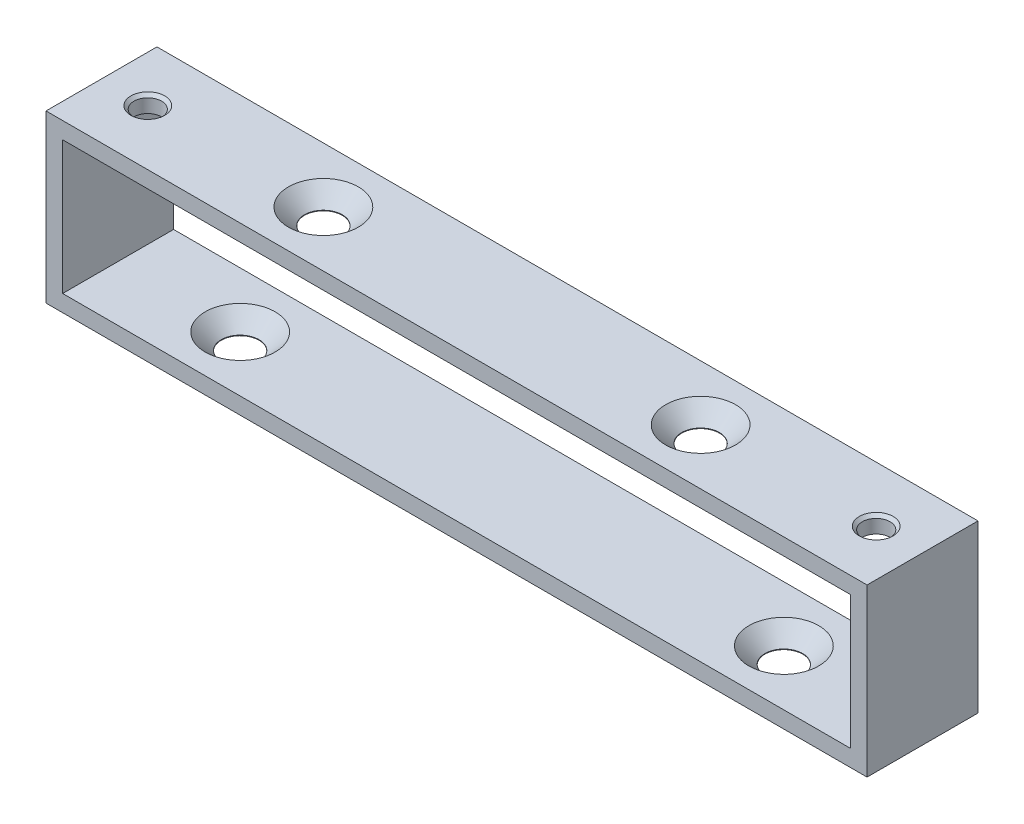
ISO-10303-21;
HEADER;
FILE_DESCRIPTION(('STEP AP214'),'2;1');
FILE_NAME('part.step','',(''),(''),'','','');
FILE_SCHEMA(('AUTOMOTIVE_DESIGN { 1 0 10303 214 1 1 1 1 }'));
ENDSEC;
DATA;
#1=APPLICATION_CONTEXT('core data for automotive mechanical design processes');
#2=APPLICATION_PROTOCOL_DEFINITION('international standard','automotive_design',2000,#1);
#3=PRODUCT_CONTEXT('',#1,'mechanical');
#4=PRODUCT('Part','Part','',(#3));
#5=PRODUCT_RELATED_PRODUCT_CATEGORY('part','',(#4));
#6=PRODUCT_DEFINITION_FORMATION('','',#4);
#7=PRODUCT_DEFINITION_CONTEXT('part definition',#1,'design');
#8=PRODUCT_DEFINITION('design','',#6,#7);
#9=PRODUCT_DEFINITION_SHAPE('','',#8);
#10=(LENGTH_UNIT() NAMED_UNIT(*) SI_UNIT(.MILLI.,.METRE.));
#11=(NAMED_UNIT(*) PLANE_ANGLE_UNIT() SI_UNIT($,.RADIAN.));
#12=(NAMED_UNIT(*) SI_UNIT($,.STERADIAN.) SOLID_ANGLE_UNIT());
#13=UNCERTAINTY_MEASURE_WITH_UNIT(LENGTH_MEASURE(1.E-05),#10,'distance_accuracy_value','');
#14=(GEOMETRIC_REPRESENTATION_CONTEXT(3) GLOBAL_UNCERTAINTY_ASSIGNED_CONTEXT((#13)) GLOBAL_UNIT_ASSIGNED_CONTEXT((#10,
#11,#12)) REPRESENTATION_CONTEXT('',''));
#15=CARTESIAN_POINT('',(0.,0.,0.));
#16=DIRECTION('',(0.,0.,1.));
#17=DIRECTION('',(1.,0.,0.));
#18=AXIS2_PLACEMENT_3D('',#15,#16,#17);
#19=CARTESIAN_POINT('',(-16.6079019313872,3.6551724137931,10.));
#20=DIRECTION('',(0.,-1.,0.));
#21=DIRECTION('',(0.,0.,-1.));
#22=AXIS2_PLACEMENT_3D('',#19,#20,#21);
#23=PLANE('',#22);
#24=DIRECTION('',(-1.,0.,0.));
#25=VECTOR('',#24,1.);
#26=CARTESIAN_POINT('',(-16.6079019313872,3.6551724137931,0.));
#27=LINE('',#26,#25);
#28=CARTESIAN_POINT('',(57.3920980686128,3.6551724137931,0.));
#29=VERTEX_POINT('',#28);
#30=CARTESIAN_POINT('',(-16.6079019313872,3.6551724137931,0.));
#31=VERTEX_POINT('',#30);
#32=EDGE_CURVE('E157',#29,#31,#27,.T.);
#33=ORIENTED_EDGE('',*,*,#32,.T.);
#34=DIRECTION('',(0.,0.,-1.));
#35=VECTOR('',#34,1.);
#36=CARTESIAN_POINT('',(-16.6079019313872,3.6551724137931,10.));
#37=LINE('',#36,#35);
#38=CARTESIAN_POINT('',(-16.6079019313872,3.6551724137931,10.));
#39=VERTEX_POINT('',#38);
#40=EDGE_CURVE('E163',#39,#31,#37,.T.);
#41=ORIENTED_EDGE('',*,*,#40,.F.);
#42=DIRECTION('',(-1.,0.,0.));
#43=VECTOR('',#42,1.);
#44=CARTESIAN_POINT('',(-16.6079019313872,3.6551724137931,10.));
#45=LINE('',#44,#43);
#46=CARTESIAN_POINT('',(57.3920980686128,3.6551724137931,10.));
#47=VERTEX_POINT('',#46);
#48=EDGE_CURVE('E161',#47,#39,#45,.T.);
#49=ORIENTED_EDGE('',*,*,#48,.F.);
#50=DIRECTION('',(0.,0.,-1.));
#51=VECTOR('',#50,1.);
#52=CARTESIAN_POINT('',(57.3920980686128,3.6551724137931,10.));
#53=LINE('',#52,#51);
#54=EDGE_CURVE('E173',#47,#29,#53,.T.);
#55=ORIENTED_EDGE('',*,*,#54,.T.);
#56=EDGE_LOOP('',(#33,#41,#49,#55));
#57=FACE_BOUND('',#56,.T.);
#58=CARTESIAN_POINT('',(37.3920980686128,3.6551724137931,5.));
#59=DIRECTION('',(0.,1.,0.));
#60=DIRECTION('',(0.,0.,1.));
#61=AXIS2_PLACEMENT_3D('',#58,#59,#60);
#62=CIRCLE('',#61,3.15);
#63=CARTESIAN_POINT('',(37.3920980686128,3.6551724137931,8.15));
#64=VERTEX_POINT('',#63);
#65=EDGE_CURVE('E323',#64,#64,#62,.T.);
#66=ORIENTED_EDGE('',*,*,#65,.F.);
#67=EDGE_LOOP('',(#66));
#68=FACE_BOUND('',#67,.T.);
#69=CARTESIAN_POINT('',(3.39209806861276,3.6551724137931,5.));
#70=DIRECTION('',(0.,1.,0.));
#71=DIRECTION('',(0.,0.,1.));
#72=AXIS2_PLACEMENT_3D('',#69,#70,#71);
#73=CIRCLE('',#72,3.15);
#74=CARTESIAN_POINT('',(3.39209806861276,3.6551724137931,8.15));
#75=VERTEX_POINT('',#74);
#76=EDGE_CURVE('E314',#75,#75,#73,.T.);
#77=ORIENTED_EDGE('',*,*,#76,.F.);
#78=EDGE_LOOP('',(#77));
#79=FACE_BOUND('',#78,.T.);
#80=CARTESIAN_POINT('',(-12.4329019313872,3.6551724137931,5.));
#81=DIRECTION('',(0.,1.,0.));
#82=DIRECTION('',(0.,0.,1.));
#83=AXIS2_PLACEMENT_3D('',#80,#81,#82);
#84=CIRCLE('',#83,1.525);
#85=CARTESIAN_POINT('',(-12.4329019313872,3.6551724137931,6.525));
#86=VERTEX_POINT('',#85);
#87=EDGE_CURVE('E305',#86,#86,#84,.T.);
#88=ORIENTED_EDGE('',*,*,#87,.F.);
#89=EDGE_LOOP('',(#88));
#90=FACE_BOUND('',#89,.T.);
#91=CARTESIAN_POINT('',(53.2170980686128,3.6551724137931,5.));
#92=DIRECTION('',(0.,1.,0.));
#93=DIRECTION('',(0.,0.,1.));
#94=AXIS2_PLACEMENT_3D('',#91,#92,#93);
#95=CIRCLE('',#94,1.525);
#96=CARTESIAN_POINT('',(53.2170980686128,3.6551724137931,6.525));
#97=VERTEX_POINT('',#96);
#98=EDGE_CURVE('E296',#97,#97,#95,.T.);
#99=ORIENTED_EDGE('',*,*,#98,.F.);
#100=EDGE_LOOP('',(#99));
#101=FACE_BOUND('',#100,.T.);
#102=ADVANCED_FACE('F51',(#57,#68,#79,#90,#101),#23,.F.);
#103=CARTESIAN_POINT('',(-16.6079019313872,3.6551724137931,10.));
#104=DIRECTION('',(1.,0.,0.));
#105=DIRECTION('',(0.,1.,0.));
#106=AXIS2_PLACEMENT_3D('',#103,#104,#105);
#107=PLANE('',#106);
#108=DIRECTION('',(0.,-1.,0.));
#109=VECTOR('',#108,1.);
#110=CARTESIAN_POINT('',(-16.6079019313872,3.6551724137931,0.));
#111=LINE('',#110,#109);
#112=CARTESIAN_POINT('',(-16.6079019313872,-11.3448275862069,0.));
#113=VERTEX_POINT('',#112);
#114=EDGE_CURVE('E130',#31,#113,#111,.T.);
#115=ORIENTED_EDGE('',*,*,#114,.T.);
#116=DIRECTION('',(0.,0.,-1.));
#117=VECTOR('',#116,1.);
#118=CARTESIAN_POINT('',(-16.6079019313872,-11.3448275862069,10.));
#119=LINE('',#118,#117);
#120=CARTESIAN_POINT('',(-16.6079019313872,-11.3448275862069,10.));
#121=VERTEX_POINT('',#120);
#122=EDGE_CURVE('E13',#121,#113,#119,.T.);
#123=ORIENTED_EDGE('',*,*,#122,.F.);
#124=DIRECTION('',(0.,-1.,0.));
#125=VECTOR('',#124,1.);
#126=CARTESIAN_POINT('',(-16.6079019313872,3.6551724137931,10.));
#127=LINE('',#126,#125);
#128=EDGE_CURVE('E153',#39,#121,#127,.T.);
#129=ORIENTED_EDGE('',*,*,#128,.F.);
#130=ORIENTED_EDGE('',*,*,#40,.T.);
#131=EDGE_LOOP('',(#115,#123,#129,#130));
#132=FACE_BOUND('',#131,.T.);
#133=ADVANCED_FACE('F53',(#132),#107,.F.);
#134=CARTESIAN_POINT('',(-16.6079019313872,-11.3448275862069,10.));
#135=DIRECTION('',(0.,1.,0.));
#136=DIRECTION('',(0.,0.,1.));
#137=AXIS2_PLACEMENT_3D('',#134,#135,#136);
#138=PLANE('',#137);
#139=CARTESIAN_POINT('',(44.8920980686128,-11.3448275862069,5.));
#140=DIRECTION('',(0.,1.,0.));
#141=DIRECTION('',(0.,0.,1.));
#142=AXIS2_PLACEMENT_3D('',#139,#140,#141);
#143=CIRCLE('',#142,1.7);
#144=CARTESIAN_POINT('',(44.8920980686128,-11.3448275862069,6.7));
#145=VERTEX_POINT('',#144);
#146=EDGE_CURVE('E283',#145,#145,#143,.T.);
#147=ORIENTED_EDGE('',*,*,#146,.T.);
#148=EDGE_LOOP('',(#147));
#149=FACE_BOUND('',#148,.T.);
#150=CARTESIAN_POINT('',(-4.10790193138724,-11.3448275862069,4.99999999999999));
#151=DIRECTION('',(0.,1.,0.));
#152=DIRECTION('',(0.,0.,1.));
#153=AXIS2_PLACEMENT_3D('',#150,#151,#152);
#154=CIRCLE('',#153,1.7);
#155=CARTESIAN_POINT('',(-4.10790193138724,-11.3448275862069,6.69999999999999));
#156=VERTEX_POINT('',#155);
#157=EDGE_CURVE('E293',#156,#156,#154,.T.);
#158=ORIENTED_EDGE('',*,*,#157,.T.);
#159=EDGE_LOOP('',(#158));
#160=FACE_BOUND('',#159,.T.);
#161=DIRECTION('',(1.,0.,0.));
#162=VECTOR('',#161,1.);
#163=CARTESIAN_POINT('',(-16.6079019313872,-11.3448275862069,0.));
#164=LINE('',#163,#162);
#165=CARTESIAN_POINT('',(57.3920980686128,-11.3448275862069,0.));
#166=VERTEX_POINT('',#165);
#167=EDGE_CURVE('E166',#113,#166,#164,.T.);
#168=ORIENTED_EDGE('',*,*,#167,.T.);
#169=DIRECTION('',(0.,0.,-1.));
#170=VECTOR('',#169,1.);
#171=CARTESIAN_POINT('',(57.3920980686128,-11.3448275862069,10.));
#172=LINE('',#171,#170);
#173=CARTESIAN_POINT('',(57.3920980686128,-11.3448275862069,10.));
#174=VERTEX_POINT('',#173);
#175=EDGE_CURVE('E59',#174,#166,#172,.T.);
#176=ORIENTED_EDGE('',*,*,#175,.F.);
#177=DIRECTION('',(1.,0.,0.));
#178=VECTOR('',#177,1.);
#179=CARTESIAN_POINT('',(-16.6079019313872,-11.3448275862069,10.));
#180=LINE('',#179,#178);
#181=EDGE_CURVE('E156',#121,#174,#180,.T.);
#182=ORIENTED_EDGE('',*,*,#181,.F.);
#183=ORIENTED_EDGE('',*,*,#122,.T.);
#184=EDGE_LOOP('',(#168,#176,#182,#183));
#185=FACE_BOUND('',#184,.T.);
#186=ADVANCED_FACE('F194',(#149,#160,#185),#138,.F.);
#187=CARTESIAN_POINT('',(57.3920980686128,3.6551724137931,10.));
#188=DIRECTION('',(-1.,0.,0.));
#189=DIRECTION('',(0.,0.,1.));
#190=AXIS2_PLACEMENT_3D('',#187,#188,#189);
#191=PLANE('',#190);
#192=DIRECTION('',(0.,1.,0.));
#193=VECTOR('',#192,1.);
#194=CARTESIAN_POINT('',(57.3920980686128,3.6551724137931,0.));
#195=LINE('',#194,#193);
#196=EDGE_CURVE('E168',#166,#29,#195,.T.);
#197=ORIENTED_EDGE('',*,*,#196,.T.);
#198=ORIENTED_EDGE('',*,*,#54,.F.);
#199=DIRECTION('',(0.,1.,0.));
#200=VECTOR('',#199,1.);
#201=CARTESIAN_POINT('',(57.3920980686128,3.6551724137931,10.));
#202=LINE('',#201,#200);
#203=EDGE_CURVE('E159',#174,#47,#202,.T.);
#204=ORIENTED_EDGE('',*,*,#203,.F.);
#205=ORIENTED_EDGE('',*,*,#175,.T.);
#206=EDGE_LOOP('',(#197,#198,#204,#205));
#207=FACE_BOUND('',#206,.T.);
#208=ADVANCED_FACE('F180',(#207),#191,.F.);
#209=CARTESIAN_POINT('',(0.,0.,10.));
#210=DIRECTION('',(0.,0.,1.));
#211=DIRECTION('',(1.,0.,0.));
#212=AXIS2_PLACEMENT_3D('',#209,#210,#211);
#213=PLANE('',#212);
#214=DIRECTION('',(0.,-1.,0.));
#215=VECTOR('',#214,1.);
#216=CARTESIAN_POINT('',(-15.1079019313872,2.1551724137931,10.));
#217=LINE('',#216,#215);
#218=CARTESIAN_POINT('',(-15.1079019313872,2.1551724137931,10.));
#219=VERTEX_POINT('',#218);
#220=CARTESIAN_POINT('',(-15.1079019313872,-9.8448275862069,10.));
#221=VERTEX_POINT('',#220);
#222=EDGE_CURVE('E66',#219,#221,#217,.T.);
#223=ORIENTED_EDGE('',*,*,#222,.F.);
#224=DIRECTION('',(-1.,0.,0.));
#225=VECTOR('',#224,1.);
#226=CARTESIAN_POINT('',(-15.1079019313872,2.1551724137931,10.));
#227=LINE('',#226,#225);
#228=CARTESIAN_POINT('',(55.8920980686128,2.1551724137931,10.));
#229=VERTEX_POINT('',#228);
#230=EDGE_CURVE('E124',#229,#219,#227,.T.);
#231=ORIENTED_EDGE('',*,*,#230,.F.);
#232=DIRECTION('',(0.,1.,0.));
#233=VECTOR('',#232,1.);
#234=CARTESIAN_POINT('',(55.8920980686128,2.1551724137931,10.));
#235=LINE('',#234,#233);
#236=CARTESIAN_POINT('',(55.8920980686128,-9.8448275862069,10.));
#237=VERTEX_POINT('',#236);
#238=EDGE_CURVE('E144',#237,#229,#235,.T.);
#239=ORIENTED_EDGE('',*,*,#238,.F.);
#240=DIRECTION('',(1.,0.,0.));
#241=VECTOR('',#240,1.);
#242=CARTESIAN_POINT('',(-15.1079019313872,-9.8448275862069,10.));
#243=LINE('',#242,#241);
#244=EDGE_CURVE('E138',#221,#237,#243,.T.);
#245=ORIENTED_EDGE('',*,*,#244,.F.);
#246=EDGE_LOOP('',(#223,#231,#239,#245));
#247=FACE_BOUND('',#246,.T.);
#248=ORIENTED_EDGE('',*,*,#128,.T.);
#249=ORIENTED_EDGE('',*,*,#181,.T.);
#250=ORIENTED_EDGE('',*,*,#203,.T.);
#251=ORIENTED_EDGE('',*,*,#48,.T.);
#252=EDGE_LOOP('',(#248,#249,#250,#251));
#253=FACE_BOUND('',#252,.T.);
#254=ADVANCED_FACE('F193',(#247,#253),#213,.T.);
#255=CARTESIAN_POINT('',(0.,0.,0.));
#256=DIRECTION('',(0.,0.,1.));
#257=DIRECTION('',(1.,0.,0.));
#258=AXIS2_PLACEMENT_3D('',#255,#256,#257);
#259=PLANE('',#258);
#260=DIRECTION('',(1.,0.,0.));
#261=VECTOR('',#260,1.);
#262=CARTESIAN_POINT('',(-15.1079019313872,2.1551724137931,0.));
#263=LINE('',#262,#261);
#264=CARTESIAN_POINT('',(-15.1079019313872,2.1551724137931,0.));
#265=VERTEX_POINT('',#264);
#266=CARTESIAN_POINT('',(55.8920980686128,2.1551724137931,0.));
#267=VERTEX_POINT('',#266);
#268=EDGE_CURVE('E136',#265,#267,#263,.T.);
#269=ORIENTED_EDGE('',*,*,#268,.F.);
#270=DIRECTION('',(0.,1.,0.));
#271=VECTOR('',#270,1.);
#272=CARTESIAN_POINT('',(-15.1079019313872,2.1551724137931,0.));
#273=LINE('',#272,#271);
#274=CARTESIAN_POINT('',(-15.1079019313872,-9.8448275862069,0.));
#275=VERTEX_POINT('',#274);
#276=EDGE_CURVE('E118',#275,#265,#273,.T.);
#277=ORIENTED_EDGE('',*,*,#276,.F.);
#278=DIRECTION('',(-1.,0.,0.));
#279=VECTOR('',#278,1.);
#280=CARTESIAN_POINT('',(-15.1079019313872,-9.8448275862069,0.));
#281=LINE('',#280,#279);
#282=CARTESIAN_POINT('',(55.8920980686128,-9.8448275862069,0.));
#283=VERTEX_POINT('',#282);
#284=EDGE_CURVE('E127',#283,#275,#281,.T.);
#285=ORIENTED_EDGE('',*,*,#284,.F.);
#286=DIRECTION('',(0.,-1.,0.));
#287=VECTOR('',#286,1.);
#288=CARTESIAN_POINT('',(55.8920980686128,2.1551724137931,0.));
#289=LINE('',#288,#287);
#290=EDGE_CURVE('E74',#267,#283,#289,.T.);
#291=ORIENTED_EDGE('',*,*,#290,.F.);
#292=EDGE_LOOP('',(#269,#277,#285,#291));
#293=FACE_BOUND('',#292,.T.);
#294=ORIENTED_EDGE('',*,*,#114,.F.);
#295=ORIENTED_EDGE('',*,*,#32,.F.);
#296=ORIENTED_EDGE('',*,*,#196,.F.);
#297=ORIENTED_EDGE('',*,*,#167,.F.);
#298=EDGE_LOOP('',(#294,#295,#296,#297));
#299=FACE_BOUND('',#298,.T.);
#300=ADVANCED_FACE('F133',(#293,#299),#259,.F.);
#301=CARTESIAN_POINT('',(-15.1079019313872,2.1551724137931,-0.000999999999999265));
#302=DIRECTION('',(-1.,0.,0.));
#303=DIRECTION('',(0.,-1.,0.));
#304=AXIS2_PLACEMENT_3D('',#301,#302,#303);
#305=PLANE('',#304);
#306=ORIENTED_EDGE('',*,*,#276,.T.);
#307=DIRECTION('',(0.,0.,1.));
#308=VECTOR('',#307,1.);
#309=CARTESIAN_POINT('',(-15.1079019313872,2.1551724137931,-0.000999999999999265));
#310=LINE('',#309,#308);
#311=EDGE_CURVE('E131',#265,#219,#310,.T.);
#312=ORIENTED_EDGE('',*,*,#311,.T.);
#313=ORIENTED_EDGE('',*,*,#222,.T.);
#314=DIRECTION('',(0.,0.,1.));
#315=VECTOR('',#314,1.);
#316=CARTESIAN_POINT('',(-15.1079019313872,-9.8448275862069,-0.000999999999999265));
#317=LINE('',#316,#315);
#318=EDGE_CURVE('E114',#275,#221,#317,.T.);
#319=ORIENTED_EDGE('',*,*,#318,.F.);
#320=EDGE_LOOP('',(#306,#312,#313,#319));
#321=FACE_BOUND('',#320,.T.);
#322=ADVANCED_FACE('F116',(#321),#305,.F.);
#323=CARTESIAN_POINT('',(-15.1079019313872,2.1551724137931,-0.000999999999999265));
#324=DIRECTION('',(0.,1.,0.));
#325=DIRECTION('',(0.,0.,1.));
#326=AXIS2_PLACEMENT_3D('',#323,#324,#325);
#327=PLANE('',#326);
#328=CARTESIAN_POINT('',(53.2170980686128,2.1551724137931,5.));
#329=DIRECTION('',(0.,1.,0.));
#330=DIRECTION('',(0.,0.,1.));
#331=AXIS2_PLACEMENT_3D('',#328,#329,#330);
#332=CIRCLE('',#331,1.25);
#333=CARTESIAN_POINT('',(53.2170980686128,2.1551724137931,6.25));
#334=VERTEX_POINT('',#333);
#335=EDGE_CURVE('E302',#334,#334,#332,.T.);
#336=ORIENTED_EDGE('',*,*,#335,.T.);
#337=EDGE_LOOP('',(#336));
#338=FACE_BOUND('',#337,.T.);
#339=CARTESIAN_POINT('',(-12.4329019313872,2.1551724137931,5.));
#340=DIRECTION('',(0.,1.,0.));
#341=DIRECTION('',(0.,0.,1.));
#342=AXIS2_PLACEMENT_3D('',#339,#340,#341);
#343=CIRCLE('',#342,1.25);
#344=CARTESIAN_POINT('',(-12.4329019313872,2.1551724137931,6.25));
#345=VERTEX_POINT('',#344);
#346=EDGE_CURVE('E311',#345,#345,#343,.T.);
#347=ORIENTED_EDGE('',*,*,#346,.T.);
#348=EDGE_LOOP('',(#347));
#349=FACE_BOUND('',#348,.T.);
#350=CARTESIAN_POINT('',(3.39209806861276,2.1551724137931,5.));
#351=DIRECTION('',(0.,1.,0.));
#352=DIRECTION('',(0.,0.,1.));
#353=AXIS2_PLACEMENT_3D('',#350,#351,#352);
#354=CIRCLE('',#353,1.7);
#355=CARTESIAN_POINT('',(3.39209806861276,2.1551724137931,6.7));
#356=VERTEX_POINT('',#355);
#357=EDGE_CURVE('E320',#356,#356,#354,.T.);
#358=ORIENTED_EDGE('',*,*,#357,.T.);
#359=EDGE_LOOP('',(#358));
#360=FACE_BOUND('',#359,.T.);
#361=CARTESIAN_POINT('',(37.3920980686128,2.1551724137931,5.));
#362=DIRECTION('',(0.,1.,0.));
#363=DIRECTION('',(0.,0.,1.));
#364=AXIS2_PLACEMENT_3D('',#361,#362,#363);
#365=CIRCLE('',#364,1.7);
#366=CARTESIAN_POINT('',(37.3920980686128,2.1551724137931,6.7));
#367=VERTEX_POINT('',#366);
#368=EDGE_CURVE('E329',#367,#367,#365,.T.);
#369=ORIENTED_EDGE('',*,*,#368,.T.);
#370=EDGE_LOOP('',(#369));
#371=FACE_BOUND('',#370,.T.);
#372=ORIENTED_EDGE('',*,*,#268,.T.);
#373=DIRECTION('',(0.,0.,1.));
#374=VECTOR('',#373,1.);
#375=CARTESIAN_POINT('',(55.8920980686128,2.1551724137931,-0.000999999999999265));
#376=LINE('',#375,#374);
#377=EDGE_CURVE('E150',#267,#229,#376,.T.);
#378=ORIENTED_EDGE('',*,*,#377,.T.);
#379=ORIENTED_EDGE('',*,*,#230,.T.);
#380=ORIENTED_EDGE('',*,*,#311,.F.);
#381=EDGE_LOOP('',(#372,#378,#379,#380));
#382=FACE_BOUND('',#381,.T.);
#383=ADVANCED_FACE('F216',(#338,#349,#360,#371,#382),#327,.F.);
#384=CARTESIAN_POINT('',(55.8920980686128,2.1551724137931,-0.000999999999999265));
#385=DIRECTION('',(1.,0.,0.));
#386=DIRECTION('',(0.,1.,0.));
#387=AXIS2_PLACEMENT_3D('',#384,#385,#386);
#388=PLANE('',#387);
#389=ORIENTED_EDGE('',*,*,#290,.T.);
#390=DIRECTION('',(0.,0.,1.));
#391=VECTOR('',#390,1.);
#392=CARTESIAN_POINT('',(55.8920980686128,-9.8448275862069,-0.000999999999999265));
#393=LINE('',#392,#391);
#394=EDGE_CURVE('E123',#283,#237,#393,.T.);
#395=ORIENTED_EDGE('',*,*,#394,.T.);
#396=ORIENTED_EDGE('',*,*,#238,.T.);
#397=ORIENTED_EDGE('',*,*,#377,.F.);
#398=EDGE_LOOP('',(#389,#395,#396,#397));
#399=FACE_BOUND('',#398,.T.);
#400=ADVANCED_FACE('F220',(#399),#388,.F.);
#401=CARTESIAN_POINT('',(-15.1079019313872,-9.8448275862069,-0.000999999999999265));
#402=DIRECTION('',(0.,-1.,0.));
#403=DIRECTION('',(0.,0.,-1.));
#404=AXIS2_PLACEMENT_3D('',#401,#402,#403);
#405=PLANE('',#404);
#406=CARTESIAN_POINT('',(44.8920980686128,-9.8448275862069,5.));
#407=DIRECTION('',(0.,1.,0.));
#408=DIRECTION('',(0.,0.,1.));
#409=AXIS2_PLACEMENT_3D('',#406,#407,#408);
#410=CIRCLE('',#409,3.15);
#411=CARTESIAN_POINT('',(44.8920980686128,-9.8448275862069,8.15));
#412=VERTEX_POINT('',#411);
#413=EDGE_CURVE('E281',#412,#412,#410,.T.);
#414=ORIENTED_EDGE('',*,*,#413,.F.);
#415=EDGE_LOOP('',(#414));
#416=FACE_BOUND('',#415,.T.);
#417=CARTESIAN_POINT('',(-4.10790193138724,-9.8448275862069,4.99999999999999));
#418=DIRECTION('',(0.,1.,0.));
#419=DIRECTION('',(0.,0.,1.));
#420=AXIS2_PLACEMENT_3D('',#417,#418,#419);
#421=CIRCLE('',#420,3.15);
#422=CARTESIAN_POINT('',(-4.10790193138724,-9.8448275862069,8.14999999999999));
#423=VERTEX_POINT('',#422);
#424=EDGE_CURVE('E287',#423,#423,#421,.T.);
#425=ORIENTED_EDGE('',*,*,#424,.F.);
#426=EDGE_LOOP('',(#425));
#427=FACE_BOUND('',#426,.T.);
#428=ORIENTED_EDGE('',*,*,#284,.T.);
#429=ORIENTED_EDGE('',*,*,#318,.T.);
#430=ORIENTED_EDGE('',*,*,#244,.T.);
#431=ORIENTED_EDGE('',*,*,#394,.F.);
#432=EDGE_LOOP('',(#428,#429,#430,#431));
#433=FACE_BOUND('',#432,.T.);
#434=ADVANCED_FACE('F128',(#416,#427,#433),#405,.F.);
#435=CARTESIAN_POINT('',(37.3920980686128,3.6551724137931,5.));
#436=DIRECTION('',(0.,1.,0.));
#437=DIRECTION('',(0.,0.,1.));
#438=AXIS2_PLACEMENT_3D('',#435,#436,#437);
#439=CYLINDRICAL_SURFACE('',#438,1.7);
#440=ORIENTED_EDGE('',*,*,#368,.F.);
#441=EDGE_LOOP('',(#440));
#442=FACE_BOUND('',#441,.T.);
#443=CARTESIAN_POINT('',(37.3920980686128,2.2051724137931,5.));
#444=DIRECTION('',(0.,1.,0.));
#445=DIRECTION('',(0.,0.,1.));
#446=AXIS2_PLACEMENT_3D('',#443,#444,#445);
#447=CIRCLE('',#446,1.7);
#448=CARTESIAN_POINT('',(37.3920980686128,2.2051724137931,6.7));
#449=VERTEX_POINT('',#448);
#450=EDGE_CURVE('E326',#449,#449,#447,.T.);
#451=ORIENTED_EDGE('',*,*,#450,.T.);
#452=EDGE_LOOP('',(#451));
#453=FACE_BOUND('',#452,.T.);
#454=ADVANCED_FACE('F219',(#442,#453),#439,.F.);
#455=CARTESIAN_POINT('',(37.3920980686128,3.6551724137931,5.));
#456=DIRECTION('',(0.,1.,0.));
#457=DIRECTION('',(0.,0.,1.));
#458=AXIS2_PLACEMENT_3D('',#455,#456,#457);
#459=CONICAL_SURFACE('',#458,3.15,0.785398163397447);
#460=ORIENTED_EDGE('',*,*,#450,.F.);
#461=EDGE_LOOP('',(#460));
#462=FACE_BOUND('',#461,.T.);
#463=ORIENTED_EDGE('',*,*,#65,.T.);
#464=EDGE_LOOP('',(#463));
#465=FACE_BOUND('',#464,.T.);
#466=ADVANCED_FACE('F229',(#462,#465),#459,.F.);
#467=CARTESIAN_POINT('',(3.39209806861276,3.6551724137931,5.));
#468=DIRECTION('',(0.,1.,0.));
#469=DIRECTION('',(0.,0.,1.));
#470=AXIS2_PLACEMENT_3D('',#467,#468,#469);
#471=CYLINDRICAL_SURFACE('',#470,1.7);
#472=ORIENTED_EDGE('',*,*,#357,.F.);
#473=EDGE_LOOP('',(#472));
#474=FACE_BOUND('',#473,.T.);
#475=CARTESIAN_POINT('',(3.39209806861276,2.2051724137931,5.));
#476=DIRECTION('',(0.,1.,0.));
#477=DIRECTION('',(0.,0.,1.));
#478=AXIS2_PLACEMENT_3D('',#475,#476,#477);
#479=CIRCLE('',#478,1.7);
#480=CARTESIAN_POINT('',(3.39209806861276,2.2051724137931,6.7));
#481=VERTEX_POINT('',#480);
#482=EDGE_CURVE('E317',#481,#481,#479,.T.);
#483=ORIENTED_EDGE('',*,*,#482,.T.);
#484=EDGE_LOOP('',(#483));
#485=FACE_BOUND('',#484,.T.);
#486=ADVANCED_FACE('F233',(#474,#485),#471,.F.);
#487=CARTESIAN_POINT('',(3.39209806861276,3.6551724137931,5.));
#488=DIRECTION('',(0.,1.,0.));
#489=DIRECTION('',(0.,0.,1.));
#490=AXIS2_PLACEMENT_3D('',#487,#488,#489);
#491=CONICAL_SURFACE('',#490,3.15,0.785398163397447);
#492=ORIENTED_EDGE('',*,*,#482,.F.);
#493=EDGE_LOOP('',(#492));
#494=FACE_BOUND('',#493,.T.);
#495=ORIENTED_EDGE('',*,*,#76,.T.);
#496=EDGE_LOOP('',(#495));
#497=FACE_BOUND('',#496,.T.);
#498=ADVANCED_FACE('F237',(#494,#497),#491,.F.);
#499=CARTESIAN_POINT('',(-12.4329019313872,3.6551724137931,5.));
#500=DIRECTION('',(0.,1.,0.));
#501=DIRECTION('',(0.,0.,1.));
#502=AXIS2_PLACEMENT_3D('',#499,#500,#501);
#503=CYLINDRICAL_SURFACE('',#502,1.25);
#504=ORIENTED_EDGE('',*,*,#346,.F.);
#505=EDGE_LOOP('',(#504));
#506=FACE_BOUND('',#505,.T.);
#507=CARTESIAN_POINT('',(-12.4329019313872,3.3801724137931,5.));
#508=DIRECTION('',(0.,1.,0.));
#509=DIRECTION('',(0.,0.,1.));
#510=AXIS2_PLACEMENT_3D('',#507,#508,#509);
#511=CIRCLE('',#510,1.25);
#512=CARTESIAN_POINT('',(-12.4329019313872,3.3801724137931,6.25));
#513=VERTEX_POINT('',#512);
#514=EDGE_CURVE('E308',#513,#513,#511,.T.);
#515=ORIENTED_EDGE('',*,*,#514,.T.);
#516=EDGE_LOOP('',(#515));
#517=FACE_BOUND('',#516,.T.);
#518=ADVANCED_FACE('F241',(#506,#517),#503,.F.);
#519=CARTESIAN_POINT('',(-12.4329019313872,3.6551724137931,5.));
#520=DIRECTION('',(0.,1.,0.));
#521=DIRECTION('',(0.,0.,1.));
#522=AXIS2_PLACEMENT_3D('',#519,#520,#521);
#523=CONICAL_SURFACE('',#522,1.525,0.785398163397448);
#524=ORIENTED_EDGE('',*,*,#514,.F.);
#525=EDGE_LOOP('',(#524));
#526=FACE_BOUND('',#525,.T.);
#527=ORIENTED_EDGE('',*,*,#87,.T.);
#528=EDGE_LOOP('',(#527));
#529=FACE_BOUND('',#528,.T.);
#530=ADVANCED_FACE('F245',(#526,#529),#523,.F.);
#531=CARTESIAN_POINT('',(53.2170980686128,3.6551724137931,5.));
#532=DIRECTION('',(0.,1.,0.));
#533=DIRECTION('',(0.,0.,1.));
#534=AXIS2_PLACEMENT_3D('',#531,#532,#533);
#535=CYLINDRICAL_SURFACE('',#534,1.25);
#536=ORIENTED_EDGE('',*,*,#335,.F.);
#537=EDGE_LOOP('',(#536));
#538=FACE_BOUND('',#537,.T.);
#539=CARTESIAN_POINT('',(53.2170980686128,3.3801724137931,5.));
#540=DIRECTION('',(0.,1.,0.));
#541=DIRECTION('',(0.,0.,1.));
#542=AXIS2_PLACEMENT_3D('',#539,#540,#541);
#543=CIRCLE('',#542,1.25);
#544=CARTESIAN_POINT('',(53.2170980686128,3.3801724137931,6.25));
#545=VERTEX_POINT('',#544);
#546=EDGE_CURVE('E299',#545,#545,#543,.T.);
#547=ORIENTED_EDGE('',*,*,#546,.T.);
#548=EDGE_LOOP('',(#547));
#549=FACE_BOUND('',#548,.T.);
#550=ADVANCED_FACE('F249',(#538,#549),#535,.F.);
#551=CARTESIAN_POINT('',(53.2170980686128,3.6551724137931,5.));
#552=DIRECTION('',(0.,1.,0.));
#553=DIRECTION('',(0.,0.,1.));
#554=AXIS2_PLACEMENT_3D('',#551,#552,#553);
#555=CONICAL_SURFACE('',#554,1.525,0.785398163397442);
#556=ORIENTED_EDGE('',*,*,#546,.F.);
#557=EDGE_LOOP('',(#556));
#558=FACE_BOUND('',#557,.T.);
#559=ORIENTED_EDGE('',*,*,#98,.T.);
#560=EDGE_LOOP('',(#559));
#561=FACE_BOUND('',#560,.T.);
#562=ADVANCED_FACE('F253',(#558,#561),#555,.F.);
#563=CARTESIAN_POINT('',(-4.10790193138724,-9.8448275862069,4.99999999999999));
#564=DIRECTION('',(0.,1.,0.));
#565=DIRECTION('',(0.,0.,1.));
#566=AXIS2_PLACEMENT_3D('',#563,#564,#565);
#567=CYLINDRICAL_SURFACE('',#566,1.7);
#568=ORIENTED_EDGE('',*,*,#157,.F.);
#569=EDGE_LOOP('',(#568));
#570=FACE_BOUND('',#569,.T.);
#571=CARTESIAN_POINT('',(-4.10790193138724,-11.2948275862069,4.99999999999999));
#572=DIRECTION('',(0.,1.,0.));
#573=DIRECTION('',(0.,0.,1.));
#574=AXIS2_PLACEMENT_3D('',#571,#572,#573);
#575=CIRCLE('',#574,1.7);
#576=CARTESIAN_POINT('',(-4.10790193138724,-11.2948275862069,6.69999999999999));
#577=VERTEX_POINT('',#576);
#578=EDGE_CURVE('E290',#577,#577,#575,.T.);
#579=ORIENTED_EDGE('',*,*,#578,.T.);
#580=EDGE_LOOP('',(#579));
#581=FACE_BOUND('',#580,.T.);
#582=ADVANCED_FACE('F257',(#570,#581),#567,.F.);
#583=CARTESIAN_POINT('',(-4.10790193138724,-9.8448275862069,4.99999999999999));
#584=DIRECTION('',(0.,1.,0.));
#585=DIRECTION('',(0.,0.,1.));
#586=AXIS2_PLACEMENT_3D('',#583,#584,#585);
#587=CONICAL_SURFACE('',#586,3.15,0.785398163397448);
#588=ORIENTED_EDGE('',*,*,#578,.F.);
#589=EDGE_LOOP('',(#588));
#590=FACE_BOUND('',#589,.T.);
#591=ORIENTED_EDGE('',*,*,#424,.T.);
#592=EDGE_LOOP('',(#591));
#593=FACE_BOUND('',#592,.T.);
#594=ADVANCED_FACE('F261',(#590,#593),#587,.F.);
#595=CARTESIAN_POINT('',(44.8920980686128,-9.8448275862069,5.));
#596=DIRECTION('',(0.,1.,0.));
#597=DIRECTION('',(0.,0.,1.));
#598=AXIS2_PLACEMENT_3D('',#595,#596,#597);
#599=CYLINDRICAL_SURFACE('',#598,1.7);
#600=ORIENTED_EDGE('',*,*,#146,.F.);
#601=EDGE_LOOP('',(#600));
#602=FACE_BOUND('',#601,.T.);
#603=CARTESIAN_POINT('',(44.8920980686128,-11.2948275862069,5.));
#604=DIRECTION('',(0.,1.,0.));
#605=DIRECTION('',(0.,0.,1.));
#606=AXIS2_PLACEMENT_3D('',#603,#604,#605);
#607=CIRCLE('',#606,1.7);
#608=CARTESIAN_POINT('',(44.8920980686128,-11.2948275862069,6.7));
#609=VERTEX_POINT('',#608);
#610=EDGE_CURVE('E278',#609,#609,#607,.T.);
#611=ORIENTED_EDGE('',*,*,#610,.T.);
#612=EDGE_LOOP('',(#611));
#613=FACE_BOUND('',#612,.T.);
#614=ADVANCED_FACE('F265',(#602,#613),#599,.F.);
#615=CARTESIAN_POINT('',(44.8920980686128,-9.8448275862069,5.));
#616=DIRECTION('',(0.,1.,0.));
#617=DIRECTION('',(0.,0.,1.));
#618=AXIS2_PLACEMENT_3D('',#615,#616,#617);
#619=CONICAL_SURFACE('',#618,3.15,0.785398163397448);
#620=ORIENTED_EDGE('',*,*,#610,.F.);
#621=EDGE_LOOP('',(#620));
#622=FACE_BOUND('',#621,.T.);
#623=ORIENTED_EDGE('',*,*,#413,.T.);
#624=EDGE_LOOP('',(#623));
#625=FACE_BOUND('',#624,.T.);
#626=ADVANCED_FACE('F269',(#622,#625),#619,.F.);
#627=CLOSED_SHELL('',(#102,#133,#186,#208,#254,#300,#322,#383,#400,#434,#454,#466,#486,#498,
#518,#530,#550,#562,#582,#594,#614,#626));
#628=MANIFOLD_SOLID_BREP('B2',#627);
#629=ADVANCED_BREP_SHAPE_REPRESENTATION('',(#18,#628),#14);
#630=SHAPE_DEFINITION_REPRESENTATION(#9,#629);
ENDSEC;
END-ISO-10303-21;
